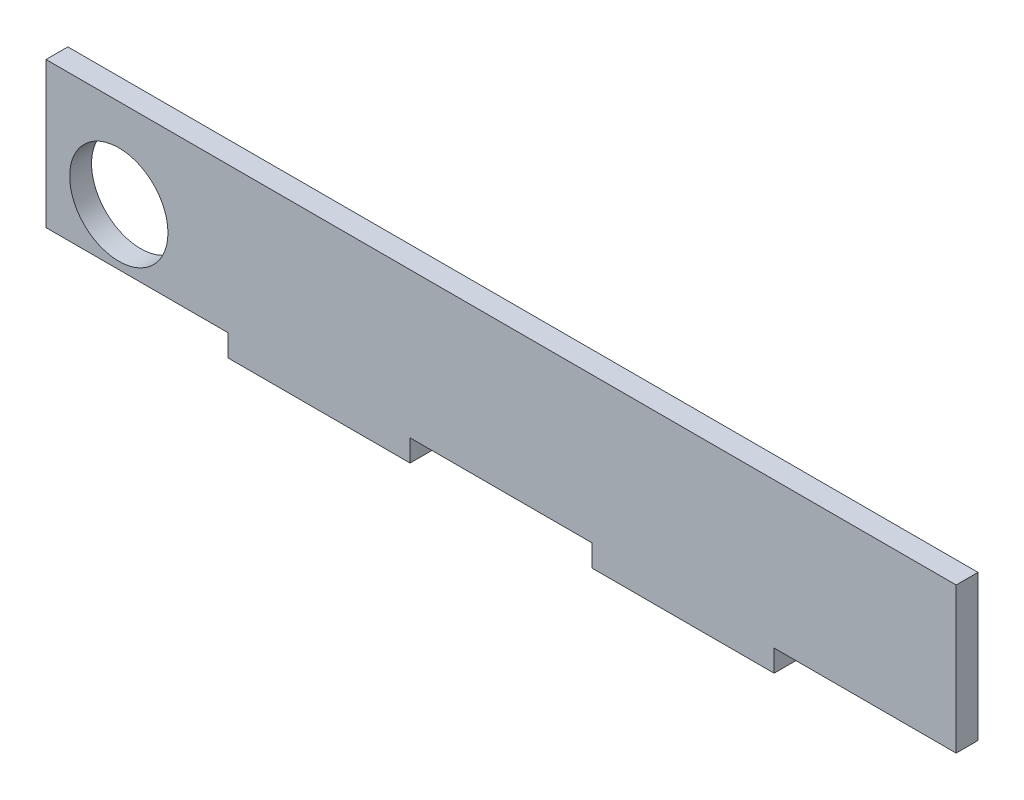
ISO-10303-21;
HEADER;
FILE_DESCRIPTION(('STEP AP214'),'2;1');
FILE_NAME('part.step','',(''),(''),'','','');
FILE_SCHEMA(('AUTOMOTIVE_DESIGN { 1 0 10303 214 1 1 1 1 }'));
ENDSEC;
DATA;
#1=APPLICATION_CONTEXT('core data for automotive mechanical design processes');
#2=APPLICATION_PROTOCOL_DEFINITION('international standard','automotive_design',2000,#1);
#3=PRODUCT_CONTEXT('',#1,'mechanical');
#4=PRODUCT('Part','Part','',(#3));
#5=PRODUCT_RELATED_PRODUCT_CATEGORY('part','',(#4));
#6=PRODUCT_DEFINITION_FORMATION('','',#4);
#7=PRODUCT_DEFINITION_CONTEXT('part definition',#1,'design');
#8=PRODUCT_DEFINITION('design','',#6,#7);
#9=PRODUCT_DEFINITION_SHAPE('','',#8);
#10=(LENGTH_UNIT() NAMED_UNIT(*) SI_UNIT(.MILLI.,.METRE.));
#11=(NAMED_UNIT(*) PLANE_ANGLE_UNIT() SI_UNIT($,.RADIAN.));
#12=(NAMED_UNIT(*) SI_UNIT($,.STERADIAN.) SOLID_ANGLE_UNIT());
#13=UNCERTAINTY_MEASURE_WITH_UNIT(LENGTH_MEASURE(1.E-05),#10,'distance_accuracy_value','');
#14=(GEOMETRIC_REPRESENTATION_CONTEXT(3) GLOBAL_UNCERTAINTY_ASSIGNED_CONTEXT((#13)) GLOBAL_UNIT_ASSIGNED_CONTEXT((#10,
#11,#12)) REPRESENTATION_CONTEXT('',''));
#15=CARTESIAN_POINT('',(0.,0.,0.));
#16=DIRECTION('',(0.,0.,1.));
#17=DIRECTION('',(1.,0.,0.));
#18=AXIS2_PLACEMENT_3D('',#15,#16,#17);
#19=CARTESIAN_POINT('',(-125.,-23.,6.));
#20=DIRECTION('',(0.,1.,0.));
#21=DIRECTION('',(0.,0.,1.));
#22=AXIS2_PLACEMENT_3D('',#19,#20,#21);
#23=PLANE('',#22);
#24=DIRECTION('',(1.,0.,0.));
#25=VECTOR('',#24,1.);
#26=CARTESIAN_POINT('',(-125.,-23.,6.));
#27=LINE('',#26,#25);
#28=CARTESIAN_POINT('',(-75.,-23.,6.));
#29=VERTEX_POINT('',#28);
#30=CARTESIAN_POINT('',(-25.,-23.,6.));
#31=VERTEX_POINT('',#30);
#32=EDGE_CURVE('E146',#29,#31,#27,.T.);
#33=ORIENTED_EDGE('',*,*,#32,.F.);
#34=DIRECTION('',(0.,0.,1.));
#35=VECTOR('',#34,1.);
#36=CARTESIAN_POINT('',(-75.,-23.,0.));
#37=LINE('',#36,#35);
#38=CARTESIAN_POINT('',(-75.,-23.,0.));
#39=VERTEX_POINT('',#38);
#40=EDGE_CURVE('E132',#39,#29,#37,.T.);
#41=ORIENTED_EDGE('',*,*,#40,.F.);
#42=DIRECTION('',(1.,0.,0.));
#43=VECTOR('',#42,1.);
#44=CARTESIAN_POINT('',(-125.,-23.,0.));
#45=LINE('',#44,#43);
#46=CARTESIAN_POINT('',(-25.,-23.,0.));
#47=VERTEX_POINT('',#46);
#48=EDGE_CURVE('E144',#39,#47,#45,.T.);
#49=ORIENTED_EDGE('',*,*,#48,.T.);
#50=DIRECTION('',(0.,0.,1.));
#51=VECTOR('',#50,1.);
#52=CARTESIAN_POINT('',(-25.,-23.,0.));
#53=LINE('',#52,#51);
#54=EDGE_CURVE('E203',#47,#31,#53,.T.);
#55=ORIENTED_EDGE('',*,*,#54,.T.);
#56=EDGE_LOOP('',(#33,#41,#49,#55));
#57=FACE_BOUND('',#56,.T.);
#58=ADVANCED_FACE('F38',(#57),#23,.F.);
#59=CARTESIAN_POINT('',(125.,23.,6.));
#60=DIRECTION('',(-1.,0.,0.));
#61=DIRECTION('',(0.,0.,1.));
#62=AXIS2_PLACEMENT_3D('',#59,#60,#61);
#63=PLANE('',#62);
#64=DIRECTION('',(0.,1.,0.));
#65=VECTOR('',#64,1.);
#66=CARTESIAN_POINT('',(125.,23.,6.));
#67=LINE('',#66,#65);
#68=CARTESIAN_POINT('',(125.,-17.,6.));
#69=VERTEX_POINT('',#68);
#70=CARTESIAN_POINT('',(125.,23.,6.));
#71=VERTEX_POINT('',#70);
#72=EDGE_CURVE('E154',#69,#71,#67,.T.);
#73=ORIENTED_EDGE('',*,*,#72,.F.);
#74=DIRECTION('',(0.,0.,1.));
#75=VECTOR('',#74,1.);
#76=CARTESIAN_POINT('',(125.,-17.,0.));
#77=LINE('',#76,#75);
#78=CARTESIAN_POINT('',(125.,-17.,0.));
#79=VERTEX_POINT('',#78);
#80=EDGE_CURVE('E250',#79,#69,#77,.T.);
#81=ORIENTED_EDGE('',*,*,#80,.F.);
#82=DIRECTION('',(0.,1.,0.));
#83=VECTOR('',#82,1.);
#84=CARTESIAN_POINT('',(125.,23.,0.));
#85=LINE('',#84,#83);
#86=CARTESIAN_POINT('',(125.,23.,0.));
#87=VERTEX_POINT('',#86);
#88=EDGE_CURVE('E184',#79,#87,#85,.T.);
#89=ORIENTED_EDGE('',*,*,#88,.T.);
#90=DIRECTION('',(0.,0.,-1.));
#91=VECTOR('',#90,1.);
#92=CARTESIAN_POINT('',(125.,23.,6.));
#93=LINE('',#92,#91);
#94=EDGE_CURVE('E11',#71,#87,#93,.T.);
#95=ORIENTED_EDGE('',*,*,#94,.F.);
#96=EDGE_LOOP('',(#73,#81,#89,#95));
#97=FACE_BOUND('',#96,.T.);
#98=ADVANCED_FACE('F40',(#97),#63,.F.);
#99=CARTESIAN_POINT('',(-125.,23.,6.));
#100=DIRECTION('',(0.,-1.,0.));
#101=DIRECTION('',(0.,0.,-1.));
#102=AXIS2_PLACEMENT_3D('',#99,#100,#101);
#103=PLANE('',#102);
#104=DIRECTION('',(-1.,0.,0.));
#105=VECTOR('',#104,1.);
#106=CARTESIAN_POINT('',(-125.,23.,0.));
#107=LINE('',#106,#105);
#108=CARTESIAN_POINT('',(-125.,23.,0.));
#109=VERTEX_POINT('',#108);
#110=EDGE_CURVE('E186',#87,#109,#107,.T.);
#111=ORIENTED_EDGE('',*,*,#110,.T.);
#112=DIRECTION('',(0.,0.,-1.));
#113=VECTOR('',#112,1.);
#114=CARTESIAN_POINT('',(-125.,23.,6.));
#115=LINE('',#114,#113);
#116=CARTESIAN_POINT('',(-125.,23.,6.));
#117=VERTEX_POINT('',#116);
#118=EDGE_CURVE('E48',#117,#109,#115,.T.);
#119=ORIENTED_EDGE('',*,*,#118,.F.);
#120=DIRECTION('',(-1.,0.,0.));
#121=VECTOR('',#120,1.);
#122=CARTESIAN_POINT('',(-125.,23.,6.));
#123=LINE('',#122,#121);
#124=EDGE_CURVE('E159',#71,#117,#123,.T.);
#125=ORIENTED_EDGE('',*,*,#124,.F.);
#126=ORIENTED_EDGE('',*,*,#94,.T.);
#127=EDGE_LOOP('',(#111,#119,#125,#126));
#128=FACE_BOUND('',#127,.T.);
#129=ADVANCED_FACE('F289',(#128),#103,.F.);
#130=CARTESIAN_POINT('',(-125.,23.,6.));
#131=DIRECTION('',(1.,0.,0.));
#132=DIRECTION('',(0.,0.,-1.));
#133=AXIS2_PLACEMENT_3D('',#130,#131,#132);
#134=PLANE('',#133);
#135=DIRECTION('',(0.,-1.,0.));
#136=VECTOR('',#135,1.);
#137=CARTESIAN_POINT('',(-125.,23.,0.));
#138=LINE('',#137,#136);
#139=CARTESIAN_POINT('',(-125.,-17.,0.));
#140=VERTEX_POINT('',#139);
#141=EDGE_CURVE('E162',#109,#140,#138,.T.);
#142=ORIENTED_EDGE('',*,*,#141,.T.);
#143=DIRECTION('',(0.,0.,1.));
#144=VECTOR('',#143,1.);
#145=CARTESIAN_POINT('',(-125.,-17.,0.));
#146=LINE('',#145,#144);
#147=CARTESIAN_POINT('',(-125.,-17.,6.));
#148=VERTEX_POINT('',#147);
#149=EDGE_CURVE('E187',#140,#148,#146,.T.);
#150=ORIENTED_EDGE('',*,*,#149,.T.);
#151=DIRECTION('',(0.,-1.,0.));
#152=VECTOR('',#151,1.);
#153=CARTESIAN_POINT('',(-125.,23.,6.));
#154=LINE('',#153,#152);
#155=EDGE_CURVE('E180',#117,#148,#154,.T.);
#156=ORIENTED_EDGE('',*,*,#155,.F.);
#157=ORIENTED_EDGE('',*,*,#118,.T.);
#158=EDGE_LOOP('',(#142,#150,#156,#157));
#159=FACE_BOUND('',#158,.T.);
#160=ADVANCED_FACE('F193',(#159),#134,.F.);
#161=CARTESIAN_POINT('',(25.,-23.,6.));
#162=VERTEX_POINT('',#161);
#163=CARTESIAN_POINT('',(75.,-23.,6.));
#164=VERTEX_POINT('',#163);
#165=EDGE_CURVE('E174',#162,#164,#27,.T.);
#166=ORIENTED_EDGE('',*,*,#165,.F.);
#167=DIRECTION('',(0.,0.,1.));
#168=VECTOR('',#167,1.);
#169=CARTESIAN_POINT('',(25.,-23.,0.));
#170=LINE('',#169,#168);
#171=CARTESIAN_POINT('',(25.,-23.,0.));
#172=VERTEX_POINT('',#171);
#173=EDGE_CURVE('E219',#172,#162,#170,.T.);
#174=ORIENTED_EDGE('',*,*,#173,.F.);
#175=CARTESIAN_POINT('',(75.,-23.,0.));
#176=VERTEX_POINT('',#175);
#177=EDGE_CURVE('E155',#172,#176,#45,.T.);
#178=ORIENTED_EDGE('',*,*,#177,.T.);
#179=DIRECTION('',(0.,0.,1.));
#180=VECTOR('',#179,1.);
#181=CARTESIAN_POINT('',(75.,-23.,0.));
#182=LINE('',#181,#180);
#183=EDGE_CURVE('E225',#176,#164,#182,.T.);
#184=ORIENTED_EDGE('',*,*,#183,.T.);
#185=EDGE_LOOP('',(#166,#174,#178,#184));
#186=FACE_BOUND('',#185,.T.);
#187=ADVANCED_FACE('F285',(#186),#23,.F.);
#188=CARTESIAN_POINT('',(0.,0.,6.));
#189=DIRECTION('',(0.,0.,1.));
#190=DIRECTION('',(1.,0.,0.));
#191=AXIS2_PLACEMENT_3D('',#188,#189,#190);
#192=PLANE('',#191);
#193=CARTESIAN_POINT('',(-105.,-1.5,6.));
#194=DIRECTION('',(0.,0.,1.));
#195=DIRECTION('',(1.,0.,0.));
#196=AXIS2_PLACEMENT_3D('',#193,#194,#195);
#197=CIRCLE('',#196,13.5);
#198=CARTESIAN_POINT('',(-91.5,-1.5,6.));
#199=VERTEX_POINT('',#198);
#200=EDGE_CURVE('E407',#199,#199,#197,.T.);
#201=ORIENTED_EDGE('',*,*,#200,.F.);
#202=EDGE_LOOP('',(#201));
#203=FACE_BOUND('',#202,.T.);
#204=DIRECTION('',(-1.,0.,0.));
#205=VECTOR('',#204,1.);
#206=CARTESIAN_POINT('',(-125.,-17.,6.));
#207=LINE('',#206,#205);
#208=CARTESIAN_POINT('',(-75.,-17.,6.));
#209=VERTEX_POINT('',#208);
#210=EDGE_CURVE('E138',#209,#148,#207,.T.);
#211=ORIENTED_EDGE('',*,*,#210,.F.);
#212=DIRECTION('',(0.,1.,0.));
#213=VECTOR('',#212,1.);
#214=CARTESIAN_POINT('',(-75.,-23.,6.));
#215=LINE('',#214,#213);
#216=EDGE_CURVE('E200',#29,#209,#215,.T.);
#217=ORIENTED_EDGE('',*,*,#216,.F.);
#218=ORIENTED_EDGE('',*,*,#32,.T.);
#219=DIRECTION('',(0.,-1.,0.));
#220=VECTOR('',#219,1.);
#221=CARTESIAN_POINT('',(-25.,-23.,6.));
#222=LINE('',#221,#220);
#223=CARTESIAN_POINT('',(-25.,-17.,6.));
#224=VERTEX_POINT('',#223);
#225=EDGE_CURVE('E214',#224,#31,#222,.T.);
#226=ORIENTED_EDGE('',*,*,#225,.F.);
#227=DIRECTION('',(-1.,0.,0.));
#228=VECTOR('',#227,1.);
#229=CARTESIAN_POINT('',(-25.,-17.,6.));
#230=LINE('',#229,#228);
#231=CARTESIAN_POINT('',(25.,-17.,6.));
#232=VERTEX_POINT('',#231);
#233=EDGE_CURVE('E224',#232,#224,#230,.T.);
#234=ORIENTED_EDGE('',*,*,#233,.F.);
#235=DIRECTION('',(0.,1.,0.));
#236=VECTOR('',#235,1.);
#237=CARTESIAN_POINT('',(25.,-23.,6.));
#238=LINE('',#237,#236);
#239=EDGE_CURVE('E220',#162,#232,#238,.T.);
#240=ORIENTED_EDGE('',*,*,#239,.F.);
#241=ORIENTED_EDGE('',*,*,#165,.T.);
#242=DIRECTION('',(0.,-1.,0.));
#243=VECTOR('',#242,1.);
#244=CARTESIAN_POINT('',(75.,-23.,6.));
#245=LINE('',#244,#243);
#246=CARTESIAN_POINT('',(75.,-17.,6.));
#247=VERTEX_POINT('',#246);
#248=EDGE_CURVE('E246',#247,#164,#245,.T.);
#249=ORIENTED_EDGE('',*,*,#248,.F.);
#250=DIRECTION('',(-1.,0.,0.));
#251=VECTOR('',#250,1.);
#252=CARTESIAN_POINT('',(75.,-17.,6.));
#253=LINE('',#252,#251);
#254=EDGE_CURVE('E251',#69,#247,#253,.T.);
#255=ORIENTED_EDGE('',*,*,#254,.F.);
#256=ORIENTED_EDGE('',*,*,#72,.T.);
#257=ORIENTED_EDGE('',*,*,#124,.T.);
#258=ORIENTED_EDGE('',*,*,#155,.T.);
#259=EDGE_LOOP('',(#211,#217,#218,#226,#234,#240,#241,#249,#255,#256,#257,#258));
#260=FACE_BOUND('',#259,.T.);
#261=ADVANCED_FACE('F268',(#203,#260),#192,.T.);
#262=CARTESIAN_POINT('',(0.,0.,0.));
#263=DIRECTION('',(0.,0.,1.));
#264=DIRECTION('',(1.,0.,0.));
#265=AXIS2_PLACEMENT_3D('',#262,#263,#264);
#266=PLANE('',#265);
#267=CARTESIAN_POINT('',(-105.,-1.5,0.));
#268=DIRECTION('',(0.,0.,1.));
#269=DIRECTION('',(1.,0.,0.));
#270=AXIS2_PLACEMENT_3D('',#267,#268,#269);
#271=CIRCLE('',#270,13.5);
#272=CARTESIAN_POINT('',(-91.5,-1.5,0.));
#273=VERTEX_POINT('',#272);
#274=EDGE_CURVE('E42',#273,#273,#271,.T.);
#275=ORIENTED_EDGE('',*,*,#274,.T.);
#276=EDGE_LOOP('',(#275));
#277=FACE_BOUND('',#276,.T.);
#278=DIRECTION('',(0.,1.,0.));
#279=VECTOR('',#278,1.);
#280=CARTESIAN_POINT('',(-75.,-23.,0.));
#281=LINE('',#280,#279);
#282=CARTESIAN_POINT('',(-75.,-17.,0.));
#283=VERTEX_POINT('',#282);
#284=EDGE_CURVE('E128',#39,#283,#281,.T.);
#285=ORIENTED_EDGE('',*,*,#284,.T.);
#286=DIRECTION('',(-1.,0.,0.));
#287=VECTOR('',#286,1.);
#288=CARTESIAN_POINT('',(-125.,-17.,0.));
#289=LINE('',#288,#287);
#290=EDGE_CURVE('E55',#283,#140,#289,.T.);
#291=ORIENTED_EDGE('',*,*,#290,.T.);
#292=ORIENTED_EDGE('',*,*,#141,.F.);
#293=ORIENTED_EDGE('',*,*,#110,.F.);
#294=ORIENTED_EDGE('',*,*,#88,.F.);
#295=DIRECTION('',(-1.,0.,0.));
#296=VECTOR('',#295,1.);
#297=CARTESIAN_POINT('',(75.,-17.,0.));
#298=LINE('',#297,#296);
#299=CARTESIAN_POINT('',(75.,-17.,0.));
#300=VERTEX_POINT('',#299);
#301=EDGE_CURVE('E241',#79,#300,#298,.T.);
#302=ORIENTED_EDGE('',*,*,#301,.T.);
#303=DIRECTION('',(0.,-1.,0.));
#304=VECTOR('',#303,1.);
#305=CARTESIAN_POINT('',(75.,-23.,0.));
#306=LINE('',#305,#304);
#307=EDGE_CURVE('E245',#300,#176,#306,.T.);
#308=ORIENTED_EDGE('',*,*,#307,.T.);
#309=ORIENTED_EDGE('',*,*,#177,.F.);
#310=DIRECTION('',(0.,1.,0.));
#311=VECTOR('',#310,1.);
#312=CARTESIAN_POINT('',(25.,-23.,0.));
#313=LINE('',#312,#311);
#314=CARTESIAN_POINT('',(25.,-17.,0.));
#315=VERTEX_POINT('',#314);
#316=EDGE_CURVE('E210',#172,#315,#313,.T.);
#317=ORIENTED_EDGE('',*,*,#316,.T.);
#318=DIRECTION('',(-1.,0.,0.));
#319=VECTOR('',#318,1.);
#320=CARTESIAN_POINT('',(-25.,-17.,0.));
#321=LINE('',#320,#319);
#322=CARTESIAN_POINT('',(-25.,-17.,0.));
#323=VERTEX_POINT('',#322);
#324=EDGE_CURVE('E63',#315,#323,#321,.T.);
#325=ORIENTED_EDGE('',*,*,#324,.T.);
#326=DIRECTION('',(0.,-1.,0.));
#327=VECTOR('',#326,1.);
#328=CARTESIAN_POINT('',(-25.,-23.,0.));
#329=LINE('',#328,#327);
#330=EDGE_CURVE('E152',#323,#47,#329,.T.);
#331=ORIENTED_EDGE('',*,*,#330,.T.);
#332=ORIENTED_EDGE('',*,*,#48,.F.);
#333=EDGE_LOOP('',(#285,#291,#292,#293,#294,#302,#308,#309,#317,#325,#331,#332));
#334=FACE_BOUND('',#333,.T.);
#335=ADVANCED_FACE('F150',(#277,#334),#266,.F.);
#336=CARTESIAN_POINT('',(75.,-23.,0.));
#337=DIRECTION('',(-1.,0.,0.));
#338=DIRECTION('',(0.,0.,1.));
#339=AXIS2_PLACEMENT_3D('',#336,#337,#338);
#340=PLANE('',#339);
#341=ORIENTED_EDGE('',*,*,#248,.T.);
#342=ORIENTED_EDGE('',*,*,#183,.F.);
#343=ORIENTED_EDGE('',*,*,#307,.F.);
#344=DIRECTION('',(0.,0.,1.));
#345=VECTOR('',#344,1.);
#346=CARTESIAN_POINT('',(75.,-17.,0.));
#347=LINE('',#346,#345);
#348=EDGE_CURVE('E260',#300,#247,#347,.T.);
#349=ORIENTED_EDGE('',*,*,#348,.T.);
#350=EDGE_LOOP('',(#341,#342,#343,#349));
#351=FACE_BOUND('',#350,.T.);
#352=ADVANCED_FACE('F311',(#351),#340,.F.);
#353=CARTESIAN_POINT('',(75.,-17.,0.));
#354=DIRECTION('',(0.,1.,0.));
#355=DIRECTION('',(0.,0.,1.));
#356=AXIS2_PLACEMENT_3D('',#353,#354,#355);
#357=PLANE('',#356);
#358=ORIENTED_EDGE('',*,*,#254,.T.);
#359=ORIENTED_EDGE('',*,*,#348,.F.);
#360=ORIENTED_EDGE('',*,*,#301,.F.);
#361=ORIENTED_EDGE('',*,*,#80,.T.);
#362=EDGE_LOOP('',(#358,#359,#360,#361));
#363=FACE_BOUND('',#362,.T.);
#364=ADVANCED_FACE('F313',(#363),#357,.F.);
#365=CARTESIAN_POINT('',(-25.,-23.,0.));
#366=DIRECTION('',(-1.,0.,0.));
#367=DIRECTION('',(0.,0.,1.));
#368=AXIS2_PLACEMENT_3D('',#365,#366,#367);
#369=PLANE('',#368);
#370=ORIENTED_EDGE('',*,*,#225,.T.);
#371=ORIENTED_EDGE('',*,*,#54,.F.);
#372=ORIENTED_EDGE('',*,*,#330,.F.);
#373=DIRECTION('',(0.,0.,1.));
#374=VECTOR('',#373,1.);
#375=CARTESIAN_POINT('',(-25.,-17.,0.));
#376=LINE('',#375,#374);
#377=EDGE_CURVE('E233',#323,#224,#376,.T.);
#378=ORIENTED_EDGE('',*,*,#377,.T.);
#379=EDGE_LOOP('',(#370,#371,#372,#378));
#380=FACE_BOUND('',#379,.T.);
#381=ADVANCED_FACE('F352',(#380),#369,.F.);
#382=CARTESIAN_POINT('',(-25.,-17.,0.));
#383=DIRECTION('',(0.,1.,0.));
#384=DIRECTION('',(0.,0.,1.));
#385=AXIS2_PLACEMENT_3D('',#382,#383,#384);
#386=PLANE('',#385);
#387=ORIENTED_EDGE('',*,*,#233,.T.);
#388=ORIENTED_EDGE('',*,*,#377,.F.);
#389=ORIENTED_EDGE('',*,*,#324,.F.);
#390=DIRECTION('',(0.,0.,1.));
#391=VECTOR('',#390,1.);
#392=CARTESIAN_POINT('',(25.,-17.,0.));
#393=LINE('',#392,#391);
#394=EDGE_CURVE('E236',#315,#232,#393,.T.);
#395=ORIENTED_EDGE('',*,*,#394,.T.);
#396=EDGE_LOOP('',(#387,#388,#389,#395));
#397=FACE_BOUND('',#396,.T.);
#398=ADVANCED_FACE('F279',(#397),#386,.F.);
#399=CARTESIAN_POINT('',(25.,-23.,0.));
#400=DIRECTION('',(1.,0.,0.));
#401=DIRECTION('',(0.,0.,-1.));
#402=AXIS2_PLACEMENT_3D('',#399,#400,#401);
#403=PLANE('',#402);
#404=ORIENTED_EDGE('',*,*,#239,.T.);
#405=ORIENTED_EDGE('',*,*,#394,.F.);
#406=ORIENTED_EDGE('',*,*,#316,.F.);
#407=ORIENTED_EDGE('',*,*,#173,.T.);
#408=EDGE_LOOP('',(#404,#405,#406,#407));
#409=FACE_BOUND('',#408,.T.);
#410=ADVANCED_FACE('F271',(#409),#403,.F.);
#411=CARTESIAN_POINT('',(-125.,-17.,0.));
#412=DIRECTION('',(0.,1.,0.));
#413=DIRECTION('',(0.,0.,1.));
#414=AXIS2_PLACEMENT_3D('',#411,#412,#413);
#415=PLANE('',#414);
#416=ORIENTED_EDGE('',*,*,#210,.T.);
#417=ORIENTED_EDGE('',*,*,#149,.F.);
#418=ORIENTED_EDGE('',*,*,#290,.F.);
#419=DIRECTION('',(0.,0.,1.));
#420=VECTOR('',#419,1.);
#421=CARTESIAN_POINT('',(-75.,-17.,0.));
#422=LINE('',#421,#420);
#423=EDGE_CURVE('E134',#283,#209,#422,.T.);
#424=ORIENTED_EDGE('',*,*,#423,.T.);
#425=EDGE_LOOP('',(#416,#417,#418,#424));
#426=FACE_BOUND('',#425,.T.);
#427=ADVANCED_FACE('F269',(#426),#415,.F.);
#428=CARTESIAN_POINT('',(-75.,-23.,0.));
#429=DIRECTION('',(1.,0.,0.));
#430=DIRECTION('',(0.,0.,-1.));
#431=AXIS2_PLACEMENT_3D('',#428,#429,#430);
#432=PLANE('',#431);
#433=ORIENTED_EDGE('',*,*,#216,.T.);
#434=ORIENTED_EDGE('',*,*,#423,.F.);
#435=ORIENTED_EDGE('',*,*,#284,.F.);
#436=ORIENTED_EDGE('',*,*,#40,.T.);
#437=EDGE_LOOP('',(#433,#434,#435,#436));
#438=FACE_BOUND('',#437,.T.);
#439=ADVANCED_FACE('F131',(#438),#432,.F.);
#440=CARTESIAN_POINT('',(-105.,-1.5,-4.));
#441=DIRECTION('',(0.,0.,1.));
#442=DIRECTION('',(1.,0.,0.));
#443=AXIS2_PLACEMENT_3D('',#440,#441,#442);
#444=CYLINDRICAL_SURFACE('',#443,13.5);
#445=ORIENTED_EDGE('',*,*,#200,.T.);
#446=EDGE_LOOP('',(#445));
#447=FACE_BOUND('',#446,.T.);
#448=ORIENTED_EDGE('',*,*,#274,.F.);
#449=EDGE_LOOP('',(#448));
#450=FACE_BOUND('',#449,.T.);
#451=ADVANCED_FACE('F277',(#447,#450),#444,.F.);
#452=CLOSED_SHELL('',(#58,#98,#129,#160,#187,#261,#335,#352,#364,#381,#398,#410,#427,#439,#451));
#453=MANIFOLD_SOLID_BREP('B2',#452);
#454=ADVANCED_BREP_SHAPE_REPRESENTATION('',(#18,#453),#14);
#455=SHAPE_DEFINITION_REPRESENTATION(#9,#454);
ENDSEC;
END-ISO-10303-21;
